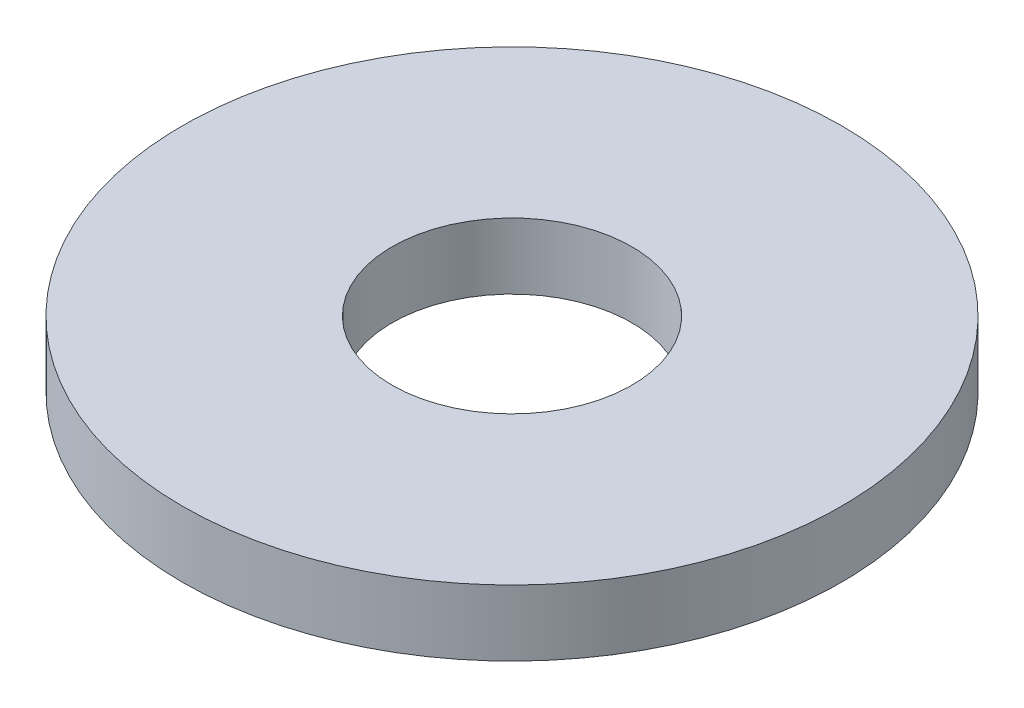
ISO-10303-21;
HEADER;
FILE_DESCRIPTION(('STEP AP214'),'2;1');
FILE_NAME('part.step','',(''),(''),'','','');
FILE_SCHEMA(('AUTOMOTIVE_DESIGN { 1 0 10303 214 1 1 1 1 }'));
ENDSEC;
DATA;
#1=APPLICATION_CONTEXT('core data for automotive mechanical design processes');
#2=APPLICATION_PROTOCOL_DEFINITION('international standard','automotive_design',2000,#1);
#3=PRODUCT_CONTEXT('',#1,'mechanical');
#4=PRODUCT('Part','Part','',(#3));
#5=PRODUCT_RELATED_PRODUCT_CATEGORY('part','',(#4));
#6=PRODUCT_DEFINITION_FORMATION('','',#4);
#7=PRODUCT_DEFINITION_CONTEXT('part definition',#1,'design');
#8=PRODUCT_DEFINITION('design','',#6,#7);
#9=PRODUCT_DEFINITION_SHAPE('','',#8);
#10=(LENGTH_UNIT() NAMED_UNIT(*) SI_UNIT(.MILLI.,.METRE.));
#11=(NAMED_UNIT(*) PLANE_ANGLE_UNIT() SI_UNIT($,.RADIAN.));
#12=(NAMED_UNIT(*) SI_UNIT($,.STERADIAN.) SOLID_ANGLE_UNIT());
#13=UNCERTAINTY_MEASURE_WITH_UNIT(LENGTH_MEASURE(1.E-05),#10,'distance_accuracy_value','');
#14=(GEOMETRIC_REPRESENTATION_CONTEXT(3) GLOBAL_UNCERTAINTY_ASSIGNED_CONTEXT((#13)) GLOBAL_UNIT_ASSIGNED_CONTEXT((#10,
#11,#12)) REPRESENTATION_CONTEXT('',''));
#15=CARTESIAN_POINT('',(0.,0.,0.));
#16=DIRECTION('',(0.,0.,1.));
#17=DIRECTION('',(1.,0.,0.));
#18=AXIS2_PLACEMENT_3D('',#15,#16,#17);
#19=CARTESIAN_POINT('',(0.,1.25,0.));
#20=DIRECTION('',(0.,1.,0.));
#21=DIRECTION('',(0.,0.,1.));
#22=AXIS2_PLACEMENT_3D('',#19,#20,#21);
#23=PLANE('',#22);
#24=CARTESIAN_POINT('',(0.,1.25,0.));
#25=DIRECTION('',(0.,1.,0.));
#26=DIRECTION('',(0.,0.,1.));
#27=AXIS2_PLACEMENT_3D('',#24,#25,#26);
#28=CIRCLE('',#27,12.5);
#29=CARTESIAN_POINT('',(0.,1.25,12.5));
#30=VERTEX_POINT('',#29);
#31=EDGE_CURVE('E10',#30,#30,#28,.T.);
#32=ORIENTED_EDGE('',*,*,#31,.T.);
#33=EDGE_LOOP('',(#32));
#34=FACE_BOUND('',#33,.T.);
#35=CARTESIAN_POINT('',(0.,1.25,0.));
#36=DIRECTION('',(0.,1.,0.));
#37=DIRECTION('',(0.,0.,1.));
#38=AXIS2_PLACEMENT_3D('',#35,#36,#37);
#39=CIRCLE('',#38,4.55);
#40=CARTESIAN_POINT('',(0.,1.25,4.55));
#41=VERTEX_POINT('',#40);
#42=EDGE_CURVE('E44',#41,#41,#39,.T.);
#43=ORIENTED_EDGE('',*,*,#42,.F.);
#44=EDGE_LOOP('',(#43));
#45=FACE_BOUND('',#44,.T.);
#46=ADVANCED_FACE('F33',(#34,#45),#23,.T.);
#47=CARTESIAN_POINT('',(0.,-1.25,0.));
#48=DIRECTION('',(0.,1.,0.));
#49=DIRECTION('',(0.,0.,1.));
#50=AXIS2_PLACEMENT_3D('',#47,#48,#49);
#51=PLANE('',#50);
#52=CARTESIAN_POINT('',(0.,-1.25,0.));
#53=DIRECTION('',(0.,1.,0.));
#54=DIRECTION('',(0.,0.,1.));
#55=AXIS2_PLACEMENT_3D('',#52,#53,#54);
#56=CIRCLE('',#55,12.5);
#57=CARTESIAN_POINT('',(0.,-1.25,12.5));
#58=VERTEX_POINT('',#57);
#59=EDGE_CURVE('E37',#58,#58,#56,.T.);
#60=ORIENTED_EDGE('',*,*,#59,.F.);
#61=EDGE_LOOP('',(#60));
#62=FACE_BOUND('',#61,.T.);
#63=CARTESIAN_POINT('',(0.,-1.25,0.));
#64=DIRECTION('',(0.,1.,0.));
#65=DIRECTION('',(0.,0.,1.));
#66=AXIS2_PLACEMENT_3D('',#63,#64,#65);
#67=CIRCLE('',#66,4.55);
#68=CARTESIAN_POINT('',(0.,-1.25,4.55));
#69=VERTEX_POINT('',#68);
#70=EDGE_CURVE('E46',#69,#69,#67,.T.);
#71=ORIENTED_EDGE('',*,*,#70,.T.);
#72=EDGE_LOOP('',(#71));
#73=FACE_BOUND('',#72,.T.);
#74=ADVANCED_FACE('F56',(#62,#73),#51,.F.);
#75=CARTESIAN_POINT('',(0.,1.25,0.));
#76=DIRECTION('',(0.,-1.,0.));
#77=DIRECTION('',(0.,0.,-1.));
#78=AXIS2_PLACEMENT_3D('',#75,#76,#77);
#79=CYLINDRICAL_SURFACE('',#78,12.5);
#80=ORIENTED_EDGE('',*,*,#31,.F.);
#81=EDGE_LOOP('',(#80));
#82=FACE_BOUND('',#81,.T.);
#83=ORIENTED_EDGE('',*,*,#59,.T.);
#84=EDGE_LOOP('',(#83));
#85=FACE_BOUND('',#84,.T.);
#86=ADVANCED_FACE('F35',(#82,#85),#79,.T.);
#87=CARTESIAN_POINT('',(0.,1.25,0.));
#88=DIRECTION('',(0.,-1.,0.));
#89=DIRECTION('',(0.,0.,-1.));
#90=AXIS2_PLACEMENT_3D('',#87,#88,#89);
#91=CYLINDRICAL_SURFACE('',#90,4.55);
#92=ORIENTED_EDGE('',*,*,#42,.T.);
#93=EDGE_LOOP('',(#92));
#94=FACE_BOUND('',#93,.T.);
#95=ORIENTED_EDGE('',*,*,#70,.F.);
#96=EDGE_LOOP('',(#95));
#97=FACE_BOUND('',#96,.T.);
#98=ADVANCED_FACE('F52',(#94,#97),#91,.F.);
#99=CLOSED_SHELL('',(#46,#74,#86,#98));
#100=MANIFOLD_SOLID_BREP('B2',#99);
#101=ADVANCED_BREP_SHAPE_REPRESENTATION('',(#18,#100),#14);
#102=SHAPE_DEFINITION_REPRESENTATION(#9,#101);
ENDSEC;
END-ISO-10303-21;
